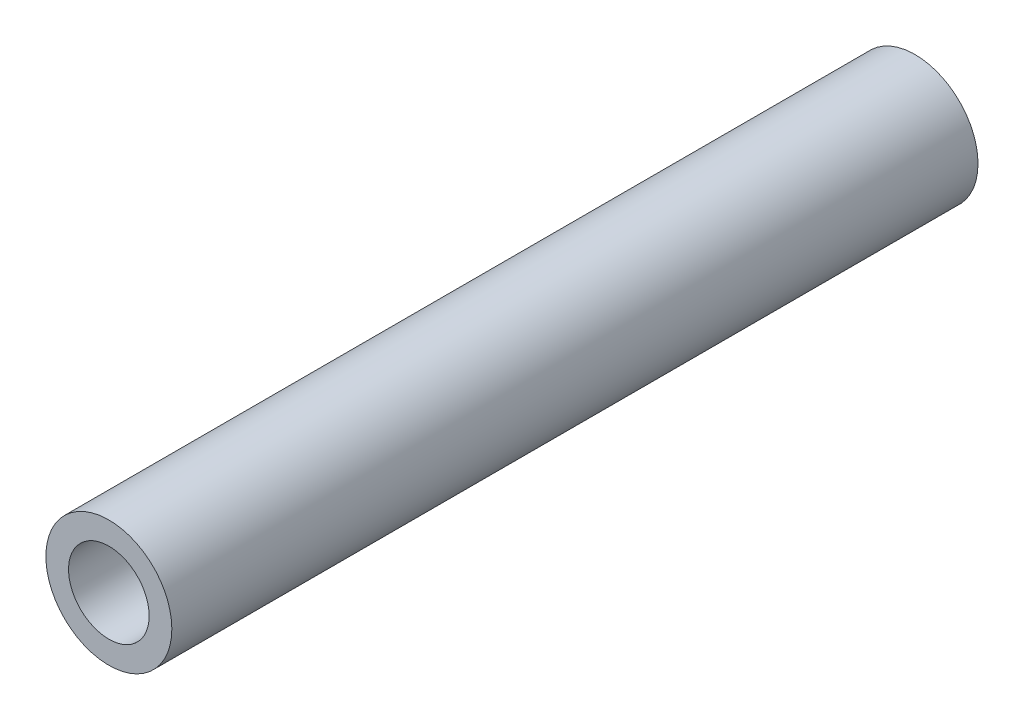
ISO-10303-21;
HEADER;
FILE_DESCRIPTION(('STEP AP214'),'2;1');
FILE_NAME('part.step','',(''),(''),'','','');
FILE_SCHEMA(('AUTOMOTIVE_DESIGN { 1 0 10303 214 1 1 1 1 }'));
ENDSEC;
DATA;
#1=APPLICATION_CONTEXT('core data for automotive mechanical design processes');
#2=APPLICATION_PROTOCOL_DEFINITION('international standard','automotive_design',2000,#1);
#3=PRODUCT_CONTEXT('',#1,'mechanical');
#4=PRODUCT('Part','Part','',(#3));
#5=PRODUCT_RELATED_PRODUCT_CATEGORY('part','',(#4));
#6=PRODUCT_DEFINITION_FORMATION('','',#4);
#7=PRODUCT_DEFINITION_CONTEXT('part definition',#1,'design');
#8=PRODUCT_DEFINITION('design','',#6,#7);
#9=PRODUCT_DEFINITION_SHAPE('','',#8);
#10=(LENGTH_UNIT() NAMED_UNIT(*) SI_UNIT(.MILLI.,.METRE.));
#11=(NAMED_UNIT(*) PLANE_ANGLE_UNIT() SI_UNIT($,.RADIAN.));
#12=(NAMED_UNIT(*) SI_UNIT($,.STERADIAN.) SOLID_ANGLE_UNIT());
#13=UNCERTAINTY_MEASURE_WITH_UNIT(LENGTH_MEASURE(1.E-05),#10,'distance_accuracy_value','');
#14=(GEOMETRIC_REPRESENTATION_CONTEXT(3) GLOBAL_UNCERTAINTY_ASSIGNED_CONTEXT((#13)) GLOBAL_UNIT_ASSIGNED_CONTEXT((#10,
#11,#12)) REPRESENTATION_CONTEXT('',''));
#15=CARTESIAN_POINT('',(0.,0.,0.));
#16=DIRECTION('',(0.,0.,1.));
#17=DIRECTION('',(1.,0.,0.));
#18=AXIS2_PLACEMENT_3D('',#15,#16,#17);
#19=CARTESIAN_POINT('',(0.,0.,50.8));
#20=DIRECTION('',(0.,0.,1.));
#21=DIRECTION('',(1.,0.,0.));
#22=AXIS2_PLACEMENT_3D('',#19,#20,#21);
#23=PLANE('',#22);
#24=CARTESIAN_POINT('',(0.,0.,50.8));
#25=DIRECTION('',(0.,0.,1.));
#26=DIRECTION('',(1.,0.,0.));
#27=AXIS2_PLACEMENT_3D('',#24,#25,#26);
#28=CIRCLE('',#27,3.96875);
#29=CARTESIAN_POINT('',(3.96875,0.,50.8));
#30=VERTEX_POINT('',#29);
#31=EDGE_CURVE('E10',#30,#30,#28,.T.);
#32=ORIENTED_EDGE('',*,*,#31,.T.);
#33=EDGE_LOOP('',(#32));
#34=FACE_BOUND('',#33,.T.);
#35=CARTESIAN_POINT('',(0.,0.,50.8));
#36=DIRECTION('',(0.,0.,1.));
#37=DIRECTION('',(1.,0.,0.));
#38=AXIS2_PLACEMENT_3D('',#35,#36,#37);
#39=CIRCLE('',#38,2.54);
#40=CARTESIAN_POINT('',(2.54,0.,50.8));
#41=VERTEX_POINT('',#40);
#42=EDGE_CURVE('E40',#41,#41,#39,.T.);
#43=ORIENTED_EDGE('',*,*,#42,.F.);
#44=EDGE_LOOP('',(#43));
#45=FACE_BOUND('',#44,.T.);
#46=ADVANCED_FACE('F29',(#34,#45),#23,.T.);
#47=CARTESIAN_POINT('',(0.,0.,0.));
#48=DIRECTION('',(0.,0.,1.));
#49=DIRECTION('',(1.,0.,0.));
#50=AXIS2_PLACEMENT_3D('',#47,#48,#49);
#51=PLANE('',#50);
#52=CARTESIAN_POINT('',(0.,0.,0.));
#53=DIRECTION('',(0.,0.,1.));
#54=DIRECTION('',(1.,0.,0.));
#55=AXIS2_PLACEMENT_3D('',#52,#53,#54);
#56=CIRCLE('',#55,3.96875);
#57=CARTESIAN_POINT('',(3.96875,0.,0.));
#58=VERTEX_POINT('',#57);
#59=EDGE_CURVE('E33',#58,#58,#56,.T.);
#60=ORIENTED_EDGE('',*,*,#59,.F.);
#61=EDGE_LOOP('',(#60));
#62=FACE_BOUND('',#61,.T.);
#63=CARTESIAN_POINT('',(0.,0.,0.));
#64=DIRECTION('',(0.,0.,1.));
#65=DIRECTION('',(1.,0.,0.));
#66=AXIS2_PLACEMENT_3D('',#63,#64,#65);
#67=CIRCLE('',#66,2.54);
#68=CARTESIAN_POINT('',(2.54,0.,0.));
#69=VERTEX_POINT('',#68);
#70=EDGE_CURVE('E42',#69,#69,#67,.T.);
#71=ORIENTED_EDGE('',*,*,#70,.T.);
#72=EDGE_LOOP('',(#71));
#73=FACE_BOUND('',#72,.T.);
#74=ADVANCED_FACE('F52',(#62,#73),#51,.F.);
#75=CARTESIAN_POINT('',(0.,0.,50.8));
#76=DIRECTION('',(0.,0.,-1.));
#77=DIRECTION('',(-1.,0.,0.));
#78=AXIS2_PLACEMENT_3D('',#75,#76,#77);
#79=CYLINDRICAL_SURFACE('',#78,3.96875);
#80=ORIENTED_EDGE('',*,*,#31,.F.);
#81=EDGE_LOOP('',(#80));
#82=FACE_BOUND('',#81,.T.);
#83=ORIENTED_EDGE('',*,*,#59,.T.);
#84=EDGE_LOOP('',(#83));
#85=FACE_BOUND('',#84,.T.);
#86=ADVANCED_FACE('F31',(#82,#85),#79,.T.);
#87=CARTESIAN_POINT('',(0.,0.,50.8));
#88=DIRECTION('',(0.,0.,-1.));
#89=DIRECTION('',(-1.,0.,0.));
#90=AXIS2_PLACEMENT_3D('',#87,#88,#89);
#91=CYLINDRICAL_SURFACE('',#90,2.54);
#92=ORIENTED_EDGE('',*,*,#42,.T.);
#93=EDGE_LOOP('',(#92));
#94=FACE_BOUND('',#93,.T.);
#95=ORIENTED_EDGE('',*,*,#70,.F.);
#96=EDGE_LOOP('',(#95));
#97=FACE_BOUND('',#96,.T.);
#98=ADVANCED_FACE('F48',(#94,#97),#91,.F.);
#99=CLOSED_SHELL('',(#46,#74,#86,#98));
#100=MANIFOLD_SOLID_BREP('B2',#99);
#101=ADVANCED_BREP_SHAPE_REPRESENTATION('',(#18,#100),#14);
#102=SHAPE_DEFINITION_REPRESENTATION(#9,#101);
ENDSEC;
END-ISO-10303-21;
